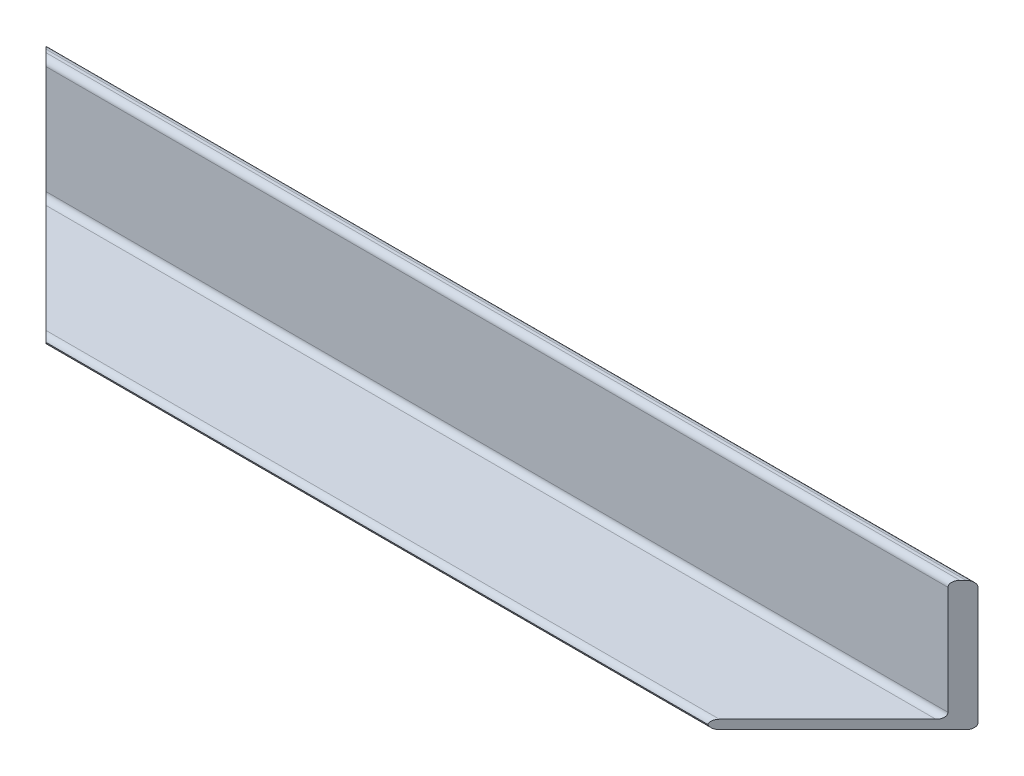
ISO-10303-21;
HEADER;
FILE_DESCRIPTION(('STEP AP214'),'2;1');
FILE_NAME('part.step','',(''),(''),'','','');
FILE_SCHEMA(('AUTOMOTIVE_DESIGN { 1 0 10303 214 1 1 1 1 }'));
ENDSEC;
DATA;
#1=APPLICATION_CONTEXT('core data for automotive mechanical design processes');
#2=APPLICATION_PROTOCOL_DEFINITION('international standard','automotive_design',2000,#1);
#3=PRODUCT_CONTEXT('',#1,'mechanical');
#4=PRODUCT('Part','Part','',(#3));
#5=PRODUCT_RELATED_PRODUCT_CATEGORY('part','',(#4));
#6=PRODUCT_DEFINITION_FORMATION('','',#4);
#7=PRODUCT_DEFINITION_CONTEXT('part definition',#1,'design');
#8=PRODUCT_DEFINITION('design','',#6,#7);
#9=PRODUCT_DEFINITION_SHAPE('','',#8);
#10=(LENGTH_UNIT() NAMED_UNIT(*) SI_UNIT(.MILLI.,.METRE.));
#11=(NAMED_UNIT(*) PLANE_ANGLE_UNIT() SI_UNIT($,.RADIAN.));
#12=(NAMED_UNIT(*) SI_UNIT($,.STERADIAN.) SOLID_ANGLE_UNIT());
#13=UNCERTAINTY_MEASURE_WITH_UNIT(LENGTH_MEASURE(1.E-05),#10,'distance_accuracy_value','');
#14=(GEOMETRIC_REPRESENTATION_CONTEXT(3) GLOBAL_UNCERTAINTY_ASSIGNED_CONTEXT((#13)) GLOBAL_UNIT_ASSIGNED_CONTEXT((#10,
#11,#12)) REPRESENTATION_CONTEXT('',''));
#15=CARTESIAN_POINT('',(0.,0.,0.));
#16=DIRECTION('',(0.,0.,1.));
#17=DIRECTION('',(1.,0.,0.));
#18=AXIS2_PLACEMENT_3D('',#15,#16,#17);
#19=CARTESIAN_POINT('',(-77.5000000000001,1.5,-11.25));
#20=DIRECTION('',(0.,0.,1.));
#21=DIRECTION('',(1.,0.,0.));
#22=AXIS2_PLACEMENT_3D('',#19,#20,#21);
#23=PLANE('',#22);
#24=DIRECTION('',(0.,-1.,0.));
#25=VECTOR('',#24,1.);
#26=CARTESIAN_POINT('',(77.4999999999999,1.5,-11.25));
#27=LINE('',#26,#25);
#28=CARTESIAN_POINT('',(77.4999999999999,20.5,-11.25));
#29=VERTEX_POINT('',#28);
#30=CARTESIAN_POINT('',(77.4999999999999,1.,-11.25));
#31=VERTEX_POINT('',#30);
#32=EDGE_CURVE('E136',#29,#31,#27,.T.);
#33=ORIENTED_EDGE('',*,*,#32,.T.);
#34=DIRECTION('',(-1.,0.,0.));
#35=VECTOR('',#34,1.);
#36=CARTESIAN_POINT('',(-77.5000000000001,1.,-11.25));
#37=LINE('',#36,#35);
#38=CARTESIAN_POINT('',(-77.5000000000001,1.,-11.25));
#39=VERTEX_POINT('',#38);
#40=EDGE_CURVE('E135',#31,#39,#37,.T.);
#41=ORIENTED_EDGE('',*,*,#40,.T.);
#42=DIRECTION('',(0.,-1.,0.));
#43=VECTOR('',#42,1.);
#44=CARTESIAN_POINT('',(-77.5000000000001,1.5,-11.25));
#45=LINE('',#44,#43);
#46=CARTESIAN_POINT('',(-77.5000000000001,20.5,-11.25));
#47=VERTEX_POINT('',#46);
#48=EDGE_CURVE('E119',#47,#39,#45,.T.);
#49=ORIENTED_EDGE('',*,*,#48,.F.);
#50=DIRECTION('',(-1.,0.,0.));
#51=VECTOR('',#50,1.);
#52=CARTESIAN_POINT('',(77.4999999999999,20.5,-11.25));
#53=LINE('',#52,#51);
#54=EDGE_CURVE('E132',#47,#29,#53,.F.);
#55=ORIENTED_EDGE('',*,*,#54,.T.);
#56=EDGE_LOOP('',(#33,#41,#49,#55));
#57=FACE_BOUND('',#56,.T.);
#58=ADVANCED_FACE('F32',(#57),#23,.F.);
#59=CARTESIAN_POINT('',(0.,1.5,0.));
#60=DIRECTION('',(0.,1.,0.));
#61=DIRECTION('',(0.,0.,1.));
#62=AXIS2_PLACEMENT_3D('',#59,#60,#61);
#63=PLANE('',#62);
#64=DIRECTION('',(-0.707106781186551,0.,-0.707106781186544));
#65=VECTOR('',#64,1.);
#66=CARTESIAN_POINT('',(-33.1249999999996,1.5,33.125));
#67=LINE('',#66,#65);
#68=CARTESIAN_POINT('',(-55.9999999999998,1.5,10.25));
#69=VERTEX_POINT('',#68);
#70=CARTESIAN_POINT('',(-74.,1.5,-7.75000000000001));
#71=VERTEX_POINT('',#70);
#72=EDGE_CURVE('E199',#69,#71,#67,.T.);
#73=ORIENTED_EDGE('',*,*,#72,.F.);
#74=DIRECTION('',(1.,0.,0.));
#75=VECTOR('',#74,1.);
#76=CARTESIAN_POINT('',(55.,1.5,10.25));
#77=LINE('',#76,#75);
#78=CARTESIAN_POINT('',(56.,1.5,10.25));
#79=VERTEX_POINT('',#78);
#80=EDGE_CURVE('E173',#69,#79,#77,.T.);
#81=ORIENTED_EDGE('',*,*,#80,.T.);
#82=DIRECTION('',(-0.707106781186546,0.,0.707106781186549));
#83=VECTOR('',#82,1.);
#84=CARTESIAN_POINT('',(33.1250000000001,1.5,33.125));
#85=LINE('',#84,#83);
#86=CARTESIAN_POINT('',(74.,1.5,-7.75000000000001));
#87=VERTEX_POINT('',#86);
#88=EDGE_CURVE('E137',#87,#79,#85,.T.);
#89=ORIENTED_EDGE('',*,*,#88,.F.);
#90=DIRECTION('',(1.,0.,0.));
#91=VECTOR('',#90,1.);
#92=CARTESIAN_POINT('',(0.,1.5,-7.75));
#93=LINE('',#92,#91);
#94=EDGE_CURVE('E171',#87,#71,#93,.F.);
#95=ORIENTED_EDGE('',*,*,#94,.T.);
#96=EDGE_LOOP('',(#73,#81,#89,#95));
#97=FACE_BOUND('',#96,.T.);
#98=ADVANCED_FACE('F189',(#97),#63,.T.);
#99=CARTESIAN_POINT('',(0.,0.,0.));
#100=DIRECTION('',(0.,1.,0.));
#101=DIRECTION('',(0.,0.,1.));
#102=AXIS2_PLACEMENT_3D('',#99,#100,#101);
#103=PLANE('',#102);
#104=DIRECTION('',(0.707106781186551,0.,0.707106781186544));
#105=VECTOR('',#104,1.);
#106=CARTESIAN_POINT('',(-54.9999999999998,0.,11.25));
#107=LINE('',#106,#105);
#108=CARTESIAN_POINT('',(-76.5000000000001,0.,-10.25));
#109=VERTEX_POINT('',#108);
#110=CARTESIAN_POINT('',(-55.9999999999998,0.,10.25));
#111=VERTEX_POINT('',#110);
#112=EDGE_CURVE('E206',#109,#111,#107,.T.);
#113=ORIENTED_EDGE('',*,*,#112,.F.);
#114=DIRECTION('',(-1.,0.,0.));
#115=VECTOR('',#114,1.);
#116=CARTESIAN_POINT('',(0.,0.,-10.25));
#117=LINE('',#116,#115);
#118=CARTESIAN_POINT('',(76.4999999999999,0.,-10.25));
#119=VERTEX_POINT('',#118);
#120=EDGE_CURVE('E157',#109,#119,#117,.F.);
#121=ORIENTED_EDGE('',*,*,#120,.T.);
#122=DIRECTION('',(0.707106781186546,0.,-0.707106781186549));
#123=VECTOR('',#122,1.);
#124=CARTESIAN_POINT('',(55.,0.,11.25));
#125=LINE('',#124,#123);
#126=CARTESIAN_POINT('',(56.,0.,10.25));
#127=VERTEX_POINT('',#126);
#128=EDGE_CURVE('E204',#127,#119,#125,.T.);
#129=ORIENTED_EDGE('',*,*,#128,.F.);
#130=DIRECTION('',(1.,0.,0.));
#131=VECTOR('',#130,1.);
#132=CARTESIAN_POINT('',(0.,0.,10.25));
#133=LINE('',#132,#131);
#134=EDGE_CURVE('E154',#127,#111,#133,.F.);
#135=ORIENTED_EDGE('',*,*,#134,.T.);
#136=EDGE_LOOP('',(#113,#121,#129,#135));
#137=FACE_BOUND('',#136,.T.);
#138=ADVANCED_FACE('F218',(#137),#103,.F.);
#139=CARTESIAN_POINT('',(-77.5000000000001,21.5,-8.75));
#140=DIRECTION('',(0.,0.,-1.));
#141=DIRECTION('',(-1.,0.,0.));
#142=AXIS2_PLACEMENT_3D('',#139,#140,#141);
#143=PLANE('',#142);
#144=DIRECTION('',(0.,-1.,0.));
#145=VECTOR('',#144,1.);
#146=CARTESIAN_POINT('',(-75.,21.5,-8.75));
#147=LINE('',#146,#145);
#148=CARTESIAN_POINT('',(-75.,20.5,-8.75));
#149=VERTEX_POINT('',#148);
#150=CARTESIAN_POINT('',(-75.,2.5,-8.75));
#151=VERTEX_POINT('',#150);
#152=EDGE_CURVE('E197',#149,#151,#147,.T.);
#153=ORIENTED_EDGE('',*,*,#152,.T.);
#154=DIRECTION('',(1.,0.,0.));
#155=VECTOR('',#154,1.);
#156=CARTESIAN_POINT('',(-77.5000000000001,2.5,-8.75));
#157=LINE('',#156,#155);
#158=CARTESIAN_POINT('',(75.,2.5,-8.75));
#159=VERTEX_POINT('',#158);
#160=EDGE_CURVE('E177',#151,#159,#157,.T.);
#161=ORIENTED_EDGE('',*,*,#160,.T.);
#162=DIRECTION('',(0.,1.,0.));
#163=VECTOR('',#162,1.);
#164=CARTESIAN_POINT('',(75.,21.5,-8.75));
#165=LINE('',#164,#163);
#166=CARTESIAN_POINT('',(75.,20.5,-8.75));
#167=VERTEX_POINT('',#166);
#168=EDGE_CURVE('E183',#159,#167,#165,.T.);
#169=ORIENTED_EDGE('',*,*,#168,.T.);
#170=DIRECTION('',(1.,0.,0.));
#171=VECTOR('',#170,1.);
#172=CARTESIAN_POINT('',(-75.0000000000001,20.5,-8.75));
#173=LINE('',#172,#171);
#174=EDGE_CURVE('E175',#167,#149,#173,.F.);
#175=ORIENTED_EDGE('',*,*,#174,.T.);
#176=EDGE_LOOP('',(#153,#161,#169,#175));
#177=FACE_BOUND('',#176,.T.);
#178=ADVANCED_FACE('F201',(#177),#143,.F.);
#179=CARTESIAN_POINT('',(0.,21.5,0.));
#180=DIRECTION('',(0.,1.,0.));
#181=DIRECTION('',(0.,0.,1.));
#182=AXIS2_PLACEMENT_3D('',#179,#180,#181);
#183=PLANE('',#182);
#184=DIRECTION('',(-0.707106781186546,0.,0.707106781186549));
#185=VECTOR('',#184,1.);
#186=CARTESIAN_POINT('',(33.1250000000001,21.5,33.125));
#187=LINE('',#186,#185);
#188=CARTESIAN_POINT('',(76.4999999999999,21.5,-10.25));
#189=VERTEX_POINT('',#188);
#190=CARTESIAN_POINT('',(76.,21.5,-9.75000000000001));
#191=VERTEX_POINT('',#190);
#192=EDGE_CURVE('E142',#189,#191,#187,.T.);
#193=ORIENTED_EDGE('',*,*,#192,.F.);
#194=DIRECTION('',(-1.,0.,0.));
#195=VECTOR('',#194,1.);
#196=CARTESIAN_POINT('',(-77.5000000000001,21.5,-10.25));
#197=LINE('',#196,#195);
#198=CARTESIAN_POINT('',(-76.5000000000001,21.5,-10.25));
#199=VERTEX_POINT('',#198);
#200=EDGE_CURVE('E169',#189,#199,#197,.T.);
#201=ORIENTED_EDGE('',*,*,#200,.T.);
#202=DIRECTION('',(0.707106781186551,0.,0.707106781186544));
#203=VECTOR('',#202,1.);
#204=CARTESIAN_POINT('',(-54.9999999999998,21.5,11.25));
#205=LINE('',#204,#203);
#206=CARTESIAN_POINT('',(-76.,21.5,-9.74999999999999));
#207=VERTEX_POINT('',#206);
#208=EDGE_CURVE('E121',#199,#207,#205,.T.);
#209=ORIENTED_EDGE('',*,*,#208,.T.);
#210=DIRECTION('',(1.,0.,0.));
#211=VECTOR('',#210,1.);
#212=CARTESIAN_POINT('',(74.9999999999999,21.5,-9.75));
#213=LINE('',#212,#211);
#214=EDGE_CURVE('E166',#207,#191,#213,.T.);
#215=ORIENTED_EDGE('',*,*,#214,.T.);
#216=EDGE_LOOP('',(#193,#201,#209,#215));
#217=FACE_BOUND('',#216,.T.);
#218=ADVANCED_FACE('F252',(#217),#183,.T.);
#219=CARTESIAN_POINT('',(55.,21.5,11.25));
#220=DIRECTION('',(-0.707106781186549,0.,-0.707106781186546));
#221=DIRECTION('',(-0.707106781186546,0.,0.707106781186549));
#222=AXIS2_PLACEMENT_3D('',#219,#220,#221);
#223=PLANE('',#222);
#224=ORIENTED_EDGE('',*,*,#128,.T.);
#225=CARTESIAN_POINT('',(76.4999999999999,1.,-10.25));
#226=DIRECTION('',(-0.707106781186549,0.,-0.707106781186546));
#227=DIRECTION('',(-0.707106781186546,0.,0.707106781186549));
#228=AXIS2_PLACEMENT_3D('',#225,#226,#227);
#229=ELLIPSE('',#228,1.41421356237309,1.);
#230=EDGE_CURVE('E164',#119,#31,#229,.F.);
#231=ORIENTED_EDGE('',*,*,#230,.T.);
#232=ORIENTED_EDGE('',*,*,#32,.F.);
#233=CARTESIAN_POINT('',(76.4999999999999,20.5,-10.25));
#234=DIRECTION('',(-0.707106781186549,0.,-0.707106781186546));
#235=DIRECTION('',(0.707106781186546,0.,-0.707106781186549));
#236=AXIS2_PLACEMENT_3D('',#233,#234,#235);
#237=ELLIPSE('',#236,1.41421356237309,1.);
#238=EDGE_CURVE('E141',#29,#189,#237,.F.);
#239=ORIENTED_EDGE('',*,*,#238,.T.);
#240=ORIENTED_EDGE('',*,*,#192,.T.);
#241=CARTESIAN_POINT('',(75.9999999999999,20.5,-9.75));
#242=DIRECTION('',(-0.707106781186549,0.,-0.707106781186546));
#243=DIRECTION('',(-0.707106781186546,0.,0.707106781186549));
#244=AXIS2_PLACEMENT_3D('',#241,#242,#243);
#245=ELLIPSE('',#244,1.41421356237309,1.);
#246=EDGE_CURVE('E55',#191,#167,#245,.F.);
#247=ORIENTED_EDGE('',*,*,#246,.T.);
#248=ORIENTED_EDGE('',*,*,#168,.F.);
#249=CARTESIAN_POINT('',(74.,2.5,-7.75));
#250=DIRECTION('',(-0.707106781186549,0.,-0.707106781186546));
#251=DIRECTION('',(0.707106781186546,0.,-0.707106781186549));
#252=AXIS2_PLACEMENT_3D('',#249,#250,#251);
#253=ELLIPSE('',#252,1.41421356237309,1.);
#254=EDGE_CURVE('E41',#159,#87,#253,.T.);
#255=ORIENTED_EDGE('',*,*,#254,.T.);
#256=ORIENTED_EDGE('',*,*,#88,.T.);
#257=CARTESIAN_POINT('',(56.,0.5,10.25));
#258=DIRECTION('',(-0.707106781186549,0.,-0.707106781186546));
#259=DIRECTION('',(-0.707106781186546,0.,0.707106781186549));
#260=AXIS2_PLACEMENT_3D('',#257,#258,#259);
#261=ELLIPSE('',#260,1.41421356237309,1.);
#262=CARTESIAN_POINT('',(55.0317541634482,0.750000000000013,11.2182458365519));
#263=VERTEX_POINT('',#262);
#264=EDGE_CURVE('E48',#79,#263,#261,.F.);
#265=ORIENTED_EDGE('',*,*,#264,.T.);
#266=CARTESIAN_POINT('',(56.,1.,10.25));
#267=DIRECTION('',(-0.707106781186549,0.,-0.707106781186546));
#268=DIRECTION('',(0.707106781186546,0.,-0.707106781186549));
#269=AXIS2_PLACEMENT_3D('',#266,#267,#268);
#270=ELLIPSE('',#269,1.41421356237309,1.);
#271=EDGE_CURVE('E161',#263,#127,#270,.F.);
#272=ORIENTED_EDGE('',*,*,#271,.T.);
#273=EDGE_LOOP('',(#224,#231,#232,#239,#240,#247,#248,#255,#256,#265,#272));
#274=FACE_BOUND('',#273,.T.);
#275=ADVANCED_FACE('F182',(#274),#223,.F.);
#276=CARTESIAN_POINT('',(-54.9999999999998,21.5,11.25));
#277=DIRECTION('',(0.707106781186544,0.,-0.707106781186551));
#278=DIRECTION('',(-0.707106781186551,0.,-0.707106781186544));
#279=AXIS2_PLACEMENT_3D('',#276,#277,#278);
#280=PLANE('',#279);
#281=ORIENTED_EDGE('',*,*,#48,.T.);
#282=CARTESIAN_POINT('',(-76.5000000000001,1.,-10.25));
#283=DIRECTION('',(0.707106781186544,0.,-0.707106781186551));
#284=DIRECTION('',(-0.707106781186551,0.,-0.707106781186544));
#285=AXIS2_PLACEMENT_3D('',#282,#283,#284);
#286=ELLIPSE('',#285,1.4142135623731,1.);
#287=EDGE_CURVE('E126',#39,#109,#286,.F.);
#288=ORIENTED_EDGE('',*,*,#287,.T.);
#289=ORIENTED_EDGE('',*,*,#112,.T.);
#290=CARTESIAN_POINT('',(-55.9999999999998,1.,10.25));
#291=DIRECTION('',(0.707106781186544,0.,-0.707106781186551));
#292=DIRECTION('',(0.707106781186551,0.,0.707106781186544));
#293=AXIS2_PLACEMENT_3D('',#290,#291,#292);
#294=ELLIPSE('',#293,1.4142135623731,1.);
#295=CARTESIAN_POINT('',(-55.031754163448,0.749999999999998,11.2182458365519));
#296=VERTEX_POINT('',#295);
#297=EDGE_CURVE('E127',#111,#296,#294,.F.);
#298=ORIENTED_EDGE('',*,*,#297,.T.);
#299=CARTESIAN_POINT('',(-55.9999999999998,0.5,10.25));
#300=DIRECTION('',(0.707106781186544,0.,-0.707106781186551));
#301=DIRECTION('',(-0.707106781186551,0.,-0.707106781186544));
#302=AXIS2_PLACEMENT_3D('',#299,#300,#301);
#303=ELLIPSE('',#302,1.4142135623731,1.);
#304=EDGE_CURVE('E150',#296,#69,#303,.F.);
#305=ORIENTED_EDGE('',*,*,#304,.T.);
#306=ORIENTED_EDGE('',*,*,#72,.T.);
#307=CARTESIAN_POINT('',(-74.,2.5,-7.75));
#308=DIRECTION('',(0.707106781186544,0.,-0.707106781186551));
#309=DIRECTION('',(0.707106781186551,0.,0.707106781186544));
#310=AXIS2_PLACEMENT_3D('',#307,#308,#309);
#311=ELLIPSE('',#310,1.4142135623731,1.);
#312=EDGE_CURVE('E11',#71,#151,#311,.T.);
#313=ORIENTED_EDGE('',*,*,#312,.T.);
#314=ORIENTED_EDGE('',*,*,#152,.F.);
#315=CARTESIAN_POINT('',(-76.,20.5,-9.75));
#316=DIRECTION('',(0.707106781186544,0.,-0.707106781186551));
#317=DIRECTION('',(-0.707106781186551,0.,-0.707106781186544));
#318=AXIS2_PLACEMENT_3D('',#315,#316,#317);
#319=ELLIPSE('',#318,1.4142135623731,1.);
#320=EDGE_CURVE('E144',#149,#207,#319,.F.);
#321=ORIENTED_EDGE('',*,*,#320,.T.);
#322=ORIENTED_EDGE('',*,*,#208,.F.);
#323=CARTESIAN_POINT('',(-76.5000000000001,20.5,-10.25));
#324=DIRECTION('',(0.707106781186544,0.,-0.707106781186551));
#325=DIRECTION('',(0.707106781186551,0.,0.707106781186544));
#326=AXIS2_PLACEMENT_3D('',#323,#324,#325);
#327=ELLIPSE('',#326,1.4142135623731,1.);
#328=EDGE_CURVE('E116',#199,#47,#327,.F.);
#329=ORIENTED_EDGE('',*,*,#328,.T.);
#330=EDGE_LOOP('',(#281,#288,#289,#298,#305,#306,#313,#314,#321,#322,#329));
#331=FACE_BOUND('',#330,.T.);
#332=ADVANCED_FACE('F118',(#331),#280,.F.);
#333=CARTESIAN_POINT('',(-77.5000000000001,1.,-10.25));
#334=DIRECTION('',(-1.,0.,0.));
#335=DIRECTION('',(0.,0.,1.));
#336=AXIS2_PLACEMENT_3D('',#333,#334,#335);
#337=CYLINDRICAL_SURFACE('',#336,1.);
#338=ORIENTED_EDGE('',*,*,#230,.F.);
#339=ORIENTED_EDGE('',*,*,#120,.F.);
#340=ORIENTED_EDGE('',*,*,#287,.F.);
#341=ORIENTED_EDGE('',*,*,#40,.F.);
#342=EDGE_LOOP('',(#338,#339,#340,#341));
#343=FACE_BOUND('',#342,.T.);
#344=ADVANCED_FACE('F213',(#343),#337,.T.);
#345=CARTESIAN_POINT('',(0.,20.5,-10.25));
#346=DIRECTION('',(1.,0.,0.));
#347=DIRECTION('',(0.,0.,-1.));
#348=AXIS2_PLACEMENT_3D('',#345,#346,#347);
#349=CYLINDRICAL_SURFACE('',#348,1.);
#350=ORIENTED_EDGE('',*,*,#238,.F.);
#351=ORIENTED_EDGE('',*,*,#54,.F.);
#352=ORIENTED_EDGE('',*,*,#328,.F.);
#353=ORIENTED_EDGE('',*,*,#200,.F.);
#354=EDGE_LOOP('',(#350,#351,#352,#353));
#355=FACE_BOUND('',#354,.T.);
#356=ADVANCED_FACE('F140',(#355),#349,.T.);
#357=CARTESIAN_POINT('',(0.,0.5,10.25));
#358=DIRECTION('',(-1.,0.,0.));
#359=DIRECTION('',(0.,0.,1.));
#360=AXIS2_PLACEMENT_3D('',#357,#358,#359);
#361=CYLINDRICAL_SURFACE('',#360,1.);
#362=ORIENTED_EDGE('',*,*,#80,.F.);
#363=ORIENTED_EDGE('',*,*,#304,.F.);
#364=DIRECTION('',(-1.,0.,0.));
#365=VECTOR('',#364,1.);
#366=CARTESIAN_POINT('',(0.,0.75,11.2182458365519));
#367=LINE('',#366,#365);
#368=EDGE_CURVE('E36',#263,#296,#367,.T.);
#369=ORIENTED_EDGE('',*,*,#368,.F.);
#370=ORIENTED_EDGE('',*,*,#264,.F.);
#371=EDGE_LOOP('',(#362,#363,#369,#370));
#372=FACE_BOUND('',#371,.T.);
#373=ADVANCED_FACE('F227',(#372),#361,.T.);
#374=CARTESIAN_POINT('',(-77.5000000000001,1.,10.25));
#375=DIRECTION('',(1.,0.,0.));
#376=DIRECTION('',(0.,0.,-1.));
#377=AXIS2_PLACEMENT_3D('',#374,#375,#376);
#378=CYLINDRICAL_SURFACE('',#377,1.);
#379=ORIENTED_EDGE('',*,*,#297,.F.);
#380=ORIENTED_EDGE('',*,*,#134,.F.);
#381=ORIENTED_EDGE('',*,*,#271,.F.);
#382=ORIENTED_EDGE('',*,*,#368,.T.);
#383=EDGE_LOOP('',(#379,#380,#381,#382));
#384=FACE_BOUND('',#383,.T.);
#385=ADVANCED_FACE('F224',(#384),#378,.T.);
#386=CARTESIAN_POINT('',(-77.5000000000001,2.5,-7.75));
#387=DIRECTION('',(1.,0.,0.));
#388=DIRECTION('',(0.,0.,-1.));
#389=AXIS2_PLACEMENT_3D('',#386,#387,#388);
#390=CYLINDRICAL_SURFACE('',#389,1.);
#391=ORIENTED_EDGE('',*,*,#312,.F.);
#392=ORIENTED_EDGE('',*,*,#94,.F.);
#393=ORIENTED_EDGE('',*,*,#254,.F.);
#394=ORIENTED_EDGE('',*,*,#160,.F.);
#395=EDGE_LOOP('',(#391,#392,#393,#394));
#396=FACE_BOUND('',#395,.T.);
#397=ADVANCED_FACE('F194',(#396),#390,.F.);
#398=CARTESIAN_POINT('',(0.,20.5,-9.75));
#399=DIRECTION('',(-1.,0.,0.));
#400=DIRECTION('',(0.,0.,1.));
#401=AXIS2_PLACEMENT_3D('',#398,#399,#400);
#402=CYLINDRICAL_SURFACE('',#401,1.);
#403=ORIENTED_EDGE('',*,*,#320,.F.);
#404=ORIENTED_EDGE('',*,*,#174,.F.);
#405=ORIENTED_EDGE('',*,*,#246,.F.);
#406=ORIENTED_EDGE('',*,*,#214,.F.);
#407=EDGE_LOOP('',(#403,#404,#405,#406));
#408=FACE_BOUND('',#407,.T.);
#409=ADVANCED_FACE('F34',(#408),#402,.T.);
#410=CLOSED_SHELL('',(#58,#98,#138,#178,#218,#275,#332,#344,#356,#373,#385,#397,#409));
#411=MANIFOLD_SOLID_BREP('B2',#410);
#412=ADVANCED_BREP_SHAPE_REPRESENTATION('',(#18,#411),#14);
#413=SHAPE_DEFINITION_REPRESENTATION(#9,#412);
ENDSEC;
END-ISO-10303-21;
